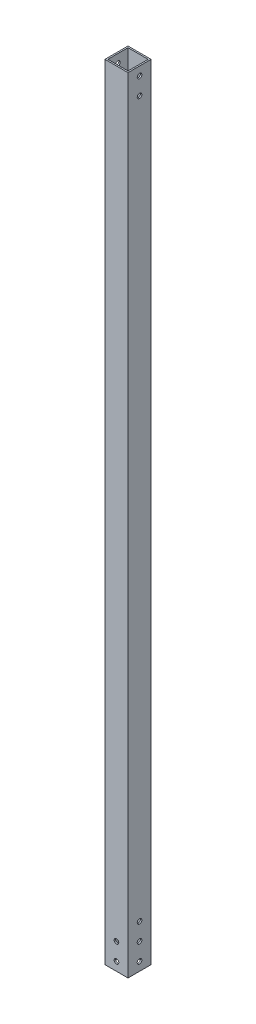
ISO-10303-21;
HEADER;
FILE_DESCRIPTION(('STEP AP214'),'2;1');
FILE_NAME('part.step','',(''),(''),'','','');
FILE_SCHEMA(('AUTOMOTIVE_DESIGN { 1 0 10303 214 1 1 1 1 }'));
ENDSEC;
DATA;
#1=APPLICATION_CONTEXT('core data for automotive mechanical design processes');
#2=APPLICATION_PROTOCOL_DEFINITION('international standard','automotive_design',2000,#1);
#3=PRODUCT_CONTEXT('',#1,'mechanical');
#4=PRODUCT('Part','Part','',(#3));
#5=PRODUCT_RELATED_PRODUCT_CATEGORY('part','',(#4));
#6=PRODUCT_DEFINITION_FORMATION('','',#4);
#7=PRODUCT_DEFINITION_CONTEXT('part definition',#1,'design');
#8=PRODUCT_DEFINITION('design','',#6,#7);
#9=PRODUCT_DEFINITION_SHAPE('','',#8);
#10=(LENGTH_UNIT() NAMED_UNIT(*) SI_UNIT(.MILLI.,.METRE.));
#11=(NAMED_UNIT(*) PLANE_ANGLE_UNIT() SI_UNIT($,.RADIAN.));
#12=(NAMED_UNIT(*) SI_UNIT($,.STERADIAN.) SOLID_ANGLE_UNIT());
#13=UNCERTAINTY_MEASURE_WITH_UNIT(LENGTH_MEASURE(1.E-05),#10,'distance_accuracy_value','');
#14=(GEOMETRIC_REPRESENTATION_CONTEXT(3) GLOBAL_UNCERTAINTY_ASSIGNED_CONTEXT((#13)) GLOBAL_UNIT_ASSIGNED_CONTEXT((#10,
#11,#12)) REPRESENTATION_CONTEXT('',''));
#15=CARTESIAN_POINT('',(0.,0.,0.));
#16=DIRECTION('',(0.,0.,1.));
#17=DIRECTION('',(1.,0.,0.));
#18=AXIS2_PLACEMENT_3D('',#15,#16,#17);
#19=CARTESIAN_POINT('',(0.,863.6,0.));
#20=DIRECTION('',(0.,1.,0.));
#21=DIRECTION('',(0.,0.,1.));
#22=AXIS2_PLACEMENT_3D('',#19,#20,#21);
#23=PLANE('',#22);
#24=DIRECTION('',(0.,0.,1.));
#25=VECTOR('',#24,1.);
#26=CARTESIAN_POINT('',(-12.7,863.6,12.7));
#27=LINE('',#26,#25);
#28=CARTESIAN_POINT('',(-12.7,863.6,-12.7));
#29=VERTEX_POINT('',#28);
#30=CARTESIAN_POINT('',(-12.7,863.6,12.7));
#31=VERTEX_POINT('',#30);
#32=EDGE_CURVE('E137',#29,#31,#27,.T.);
#33=ORIENTED_EDGE('',*,*,#32,.T.);
#34=DIRECTION('',(1.,0.,0.));
#35=VECTOR('',#34,1.);
#36=CARTESIAN_POINT('',(12.7,863.6,12.7));
#37=LINE('',#36,#35);
#38=CARTESIAN_POINT('',(12.7,863.6,12.7));
#39=VERTEX_POINT('',#38);
#40=EDGE_CURVE('E140',#31,#39,#37,.T.);
#41=ORIENTED_EDGE('',*,*,#40,.T.);
#42=DIRECTION('',(0.,0.,-1.));
#43=VECTOR('',#42,1.);
#44=CARTESIAN_POINT('',(12.7,863.6,12.7));
#45=LINE('',#44,#43);
#46=CARTESIAN_POINT('',(12.7,863.6,-12.7));
#47=VERTEX_POINT('',#46);
#48=EDGE_CURVE('E143',#39,#47,#45,.T.);
#49=ORIENTED_EDGE('',*,*,#48,.T.);
#50=DIRECTION('',(-1.,0.,0.));
#51=VECTOR('',#50,1.);
#52=CARTESIAN_POINT('',(12.7,863.6,-12.7));
#53=LINE('',#52,#51);
#54=EDGE_CURVE('E145',#47,#29,#53,.T.);
#55=ORIENTED_EDGE('',*,*,#54,.T.);
#56=EDGE_LOOP('',(#33,#41,#49,#55));
#57=FACE_BOUND('',#56,.T.);
#58=DIRECTION('',(-1.,0.,0.));
#59=VECTOR('',#58,1.);
#60=CARTESIAN_POINT('',(11.1125,863.6,-11.1125));
#61=LINE('',#60,#59);
#62=CARTESIAN_POINT('',(11.1125,863.6,-11.1125));
#63=VERTEX_POINT('',#62);
#64=CARTESIAN_POINT('',(-11.1125,863.6,-11.1125));
#65=VERTEX_POINT('',#64);
#66=EDGE_CURVE('E107',#63,#65,#61,.T.);
#67=ORIENTED_EDGE('',*,*,#66,.F.);
#68=DIRECTION('',(0.,0.,-1.));
#69=VECTOR('',#68,1.);
#70=CARTESIAN_POINT('',(11.1125,863.6,11.1125));
#71=LINE('',#70,#69);
#72=CARTESIAN_POINT('',(11.1125,863.6,11.1125));
#73=VERTEX_POINT('',#72);
#74=EDGE_CURVE('E99',#73,#63,#71,.T.);
#75=ORIENTED_EDGE('',*,*,#74,.F.);
#76=DIRECTION('',(1.,0.,0.));
#77=VECTOR('',#76,1.);
#78=CARTESIAN_POINT('',(11.1125,863.6,11.1125));
#79=LINE('',#78,#77);
#80=CARTESIAN_POINT('',(-11.1125,863.6,11.1125));
#81=VERTEX_POINT('',#80);
#82=EDGE_CURVE('E121',#81,#73,#79,.T.);
#83=ORIENTED_EDGE('',*,*,#82,.F.);
#84=DIRECTION('',(0.,0.,1.));
#85=VECTOR('',#84,1.);
#86=CARTESIAN_POINT('',(-11.1125,863.6,11.1125));
#87=LINE('',#86,#85);
#88=EDGE_CURVE('E119',#65,#81,#87,.T.);
#89=ORIENTED_EDGE('',*,*,#88,.F.);
#90=EDGE_LOOP('',(#67,#75,#83,#89));
#91=FACE_BOUND('',#90,.T.);
#92=ADVANCED_FACE('F32',(#57,#91),#23,.T.);
#93=CARTESIAN_POINT('',(0.,0.,0.));
#94=DIRECTION('',(0.,1.,0.));
#95=DIRECTION('',(0.,0.,1.));
#96=AXIS2_PLACEMENT_3D('',#93,#94,#95);
#97=PLANE('',#96);
#98=DIRECTION('',(0.,0.,1.));
#99=VECTOR('',#98,1.);
#100=CARTESIAN_POINT('',(-12.7,0.,12.7));
#101=LINE('',#100,#99);
#102=CARTESIAN_POINT('',(-12.7,0.,-12.7));
#103=VERTEX_POINT('',#102);
#104=CARTESIAN_POINT('',(-12.7,0.,12.7));
#105=VERTEX_POINT('',#104);
#106=EDGE_CURVE('E115',#103,#105,#101,.T.);
#107=ORIENTED_EDGE('',*,*,#106,.F.);
#108=DIRECTION('',(-1.,0.,0.));
#109=VECTOR('',#108,1.);
#110=CARTESIAN_POINT('',(12.7,0.,-12.7));
#111=LINE('',#110,#109);
#112=CARTESIAN_POINT('',(12.7,0.,-12.7));
#113=VERTEX_POINT('',#112);
#114=EDGE_CURVE('E141',#113,#103,#111,.T.);
#115=ORIENTED_EDGE('',*,*,#114,.F.);
#116=DIRECTION('',(0.,0.,-1.));
#117=VECTOR('',#116,1.);
#118=CARTESIAN_POINT('',(12.7,0.,12.7));
#119=LINE('',#118,#117);
#120=CARTESIAN_POINT('',(12.7,0.,12.7));
#121=VERTEX_POINT('',#120);
#122=EDGE_CURVE('E152',#121,#113,#119,.T.);
#123=ORIENTED_EDGE('',*,*,#122,.F.);
#124=DIRECTION('',(1.,0.,0.));
#125=VECTOR('',#124,1.);
#126=CARTESIAN_POINT('',(12.7,0.,12.7));
#127=LINE('',#126,#125);
#128=EDGE_CURVE('E150',#105,#121,#127,.T.);
#129=ORIENTED_EDGE('',*,*,#128,.F.);
#130=EDGE_LOOP('',(#107,#115,#123,#129));
#131=FACE_BOUND('',#130,.T.);
#132=DIRECTION('',(0.,0.,-1.));
#133=VECTOR('',#132,1.);
#134=CARTESIAN_POINT('',(11.1125,0.,11.1125));
#135=LINE('',#134,#133);
#136=CARTESIAN_POINT('',(11.1125,0.,11.1125));
#137=VERTEX_POINT('',#136);
#138=CARTESIAN_POINT('',(11.1125,0.,-11.1125));
#139=VERTEX_POINT('',#138);
#140=EDGE_CURVE('E57',#137,#139,#135,.T.);
#141=ORIENTED_EDGE('',*,*,#140,.T.);
#142=DIRECTION('',(-1.,0.,0.));
#143=VECTOR('',#142,1.);
#144=CARTESIAN_POINT('',(11.1125,0.,-11.1125));
#145=LINE('',#144,#143);
#146=CARTESIAN_POINT('',(-11.1125,0.,-11.1125));
#147=VERTEX_POINT('',#146);
#148=EDGE_CURVE('E114',#139,#147,#145,.T.);
#149=ORIENTED_EDGE('',*,*,#148,.T.);
#150=DIRECTION('',(0.,0.,1.));
#151=VECTOR('',#150,1.);
#152=CARTESIAN_POINT('',(-11.1125,0.,11.1125));
#153=LINE('',#152,#151);
#154=CARTESIAN_POINT('',(-11.1125,0.,11.1125));
#155=VERTEX_POINT('',#154);
#156=EDGE_CURVE('E129',#147,#155,#153,.T.);
#157=ORIENTED_EDGE('',*,*,#156,.T.);
#158=DIRECTION('',(1.,0.,0.));
#159=VECTOR('',#158,1.);
#160=CARTESIAN_POINT('',(11.1125,0.,11.1125));
#161=LINE('',#160,#159);
#162=EDGE_CURVE('E108',#155,#137,#161,.T.);
#163=ORIENTED_EDGE('',*,*,#162,.T.);
#164=EDGE_LOOP('',(#141,#149,#157,#163));
#165=FACE_BOUND('',#164,.T.);
#166=ADVANCED_FACE('F247',(#131,#165),#97,.F.);
#167=CARTESIAN_POINT('',(-12.7,863.6,12.7));
#168=DIRECTION('',(1.,0.,0.));
#169=DIRECTION('',(0.,0.,-1.));
#170=AXIS2_PLACEMENT_3D('',#167,#168,#169);
#171=PLANE('',#170);
#172=CARTESIAN_POINT('',(-12.7,9.525,0.));
#173=DIRECTION('',(1.,0.,0.));
#174=DIRECTION('',(0.,0.,-1.));
#175=AXIS2_PLACEMENT_3D('',#172,#173,#174);
#176=CIRCLE('',#175,2.5527);
#177=CARTESIAN_POINT('',(-12.7,9.525,-2.5527));
#178=VERTEX_POINT('',#177);
#179=EDGE_CURVE('E174',#178,#178,#176,.T.);
#180=ORIENTED_EDGE('',*,*,#179,.T.);
#181=EDGE_LOOP('',(#180));
#182=FACE_BOUND('',#181,.T.);
#183=CARTESIAN_POINT('',(-12.7,28.575,0.));
#184=DIRECTION('',(1.,0.,0.));
#185=DIRECTION('',(0.,0.,-1.));
#186=AXIS2_PLACEMENT_3D('',#183,#184,#185);
#187=CIRCLE('',#186,2.5527);
#188=CARTESIAN_POINT('',(-12.7,28.575,-2.5527));
#189=VERTEX_POINT('',#188);
#190=EDGE_CURVE('E325',#189,#189,#187,.T.);
#191=ORIENTED_EDGE('',*,*,#190,.T.);
#192=EDGE_LOOP('',(#191));
#193=FACE_BOUND('',#192,.T.);
#194=CARTESIAN_POINT('',(-12.7,47.625,0.));
#195=DIRECTION('',(1.,0.,0.));
#196=DIRECTION('',(0.,0.,-1.));
#197=AXIS2_PLACEMENT_3D('',#194,#195,#196);
#198=CIRCLE('',#197,2.5527);
#199=CARTESIAN_POINT('',(-12.7,47.625,-2.5527));
#200=VERTEX_POINT('',#199);
#201=EDGE_CURVE('E335',#200,#200,#198,.T.);
#202=ORIENTED_EDGE('',*,*,#201,.T.);
#203=EDGE_LOOP('',(#202));
#204=FACE_BOUND('',#203,.T.);
#205=CARTESIAN_POINT('',(-12.7,854.075,0.));
#206=DIRECTION('',(1.,0.,0.));
#207=DIRECTION('',(0.,0.,-1.));
#208=AXIS2_PLACEMENT_3D('',#205,#206,#207);
#209=CIRCLE('',#208,2.55270000000004);
#210=CARTESIAN_POINT('',(-12.7,854.075,-2.55270000000004));
#211=VERTEX_POINT('',#210);
#212=EDGE_CURVE('E341',#211,#211,#209,.T.);
#213=ORIENTED_EDGE('',*,*,#212,.T.);
#214=EDGE_LOOP('',(#213));
#215=FACE_BOUND('',#214,.T.);
#216=CARTESIAN_POINT('',(-12.7,835.025,0.));
#217=DIRECTION('',(1.,0.,0.));
#218=DIRECTION('',(0.,0.,-1.));
#219=AXIS2_PLACEMENT_3D('',#216,#217,#218);
#220=CIRCLE('',#219,2.55270000000004);
#221=CARTESIAN_POINT('',(-12.7,835.025,-2.55270000000004));
#222=VERTEX_POINT('',#221);
#223=EDGE_CURVE('E347',#222,#222,#220,.T.);
#224=ORIENTED_EDGE('',*,*,#223,.T.);
#225=EDGE_LOOP('',(#224));
#226=FACE_BOUND('',#225,.T.);
#227=ORIENTED_EDGE('',*,*,#106,.T.);
#228=DIRECTION('',(0.,-1.,0.));
#229=VECTOR('',#228,1.);
#230=CARTESIAN_POINT('',(-12.7,863.6,12.7));
#231=LINE('',#230,#229);
#232=EDGE_CURVE('E11',#31,#105,#231,.T.);
#233=ORIENTED_EDGE('',*,*,#232,.F.);
#234=ORIENTED_EDGE('',*,*,#32,.F.);
#235=DIRECTION('',(0.,-1.,0.));
#236=VECTOR('',#235,1.);
#237=CARTESIAN_POINT('',(-12.7,863.6,-12.7));
#238=LINE('',#237,#236);
#239=EDGE_CURVE('E147',#29,#103,#238,.T.);
#240=ORIENTED_EDGE('',*,*,#239,.T.);
#241=EDGE_LOOP('',(#227,#233,#234,#240));
#242=FACE_BOUND('',#241,.T.);
#243=ADVANCED_FACE('F34',(#182,#193,#204,#215,#226,#242),#171,.F.);
#244=CARTESIAN_POINT('',(12.7,863.6,12.7));
#245=DIRECTION('',(0.,0.,-1.));
#246=DIRECTION('',(-1.,0.,0.));
#247=AXIS2_PLACEMENT_3D('',#244,#245,#246);
#248=PLANE('',#247);
#249=CARTESIAN_POINT('',(0.,9.525,12.7));
#250=DIRECTION('',(0.,0.,1.));
#251=DIRECTION('',(1.,0.,0.));
#252=AXIS2_PLACEMENT_3D('',#249,#250,#251);
#253=CIRCLE('',#252,2.5527);
#254=CARTESIAN_POINT('',(2.5527,9.525,12.7));
#255=VERTEX_POINT('',#254);
#256=EDGE_CURVE('E202',#255,#255,#253,.T.);
#257=ORIENTED_EDGE('',*,*,#256,.F.);
#258=EDGE_LOOP('',(#257));
#259=FACE_BOUND('',#258,.T.);
#260=CARTESIAN_POINT('',(0.,28.575,12.7));
#261=DIRECTION('',(0.,0.,1.));
#262=DIRECTION('',(1.,0.,0.));
#263=AXIS2_PLACEMENT_3D('',#260,#261,#262);
#264=CIRCLE('',#263,2.5527);
#265=CARTESIAN_POINT('',(2.5527,28.575,12.7));
#266=VERTEX_POINT('',#265);
#267=EDGE_CURVE('E199',#266,#266,#264,.T.);
#268=ORIENTED_EDGE('',*,*,#267,.F.);
#269=EDGE_LOOP('',(#268));
#270=FACE_BOUND('',#269,.T.);
#271=ORIENTED_EDGE('',*,*,#128,.T.);
#272=DIRECTION('',(0.,-1.,0.));
#273=VECTOR('',#272,1.);
#274=CARTESIAN_POINT('',(12.7,863.6,12.7));
#275=LINE('',#274,#273);
#276=EDGE_CURVE('E41',#39,#121,#275,.T.);
#277=ORIENTED_EDGE('',*,*,#276,.F.);
#278=ORIENTED_EDGE('',*,*,#40,.F.);
#279=ORIENTED_EDGE('',*,*,#232,.T.);
#280=EDGE_LOOP('',(#271,#277,#278,#279));
#281=FACE_BOUND('',#280,.T.);
#282=ADVANCED_FACE('F251',(#259,#270,#281),#248,.F.);
#283=CARTESIAN_POINT('',(12.7,863.6,12.7));
#284=DIRECTION('',(-1.,0.,0.));
#285=DIRECTION('',(0.,0.,1.));
#286=AXIS2_PLACEMENT_3D('',#283,#284,#285);
#287=PLANE('',#286);
#288=CARTESIAN_POINT('',(12.7,9.525,0.));
#289=DIRECTION('',(1.,0.,0.));
#290=DIRECTION('',(0.,0.,-1.));
#291=AXIS2_PLACEMENT_3D('',#288,#289,#290);
#292=CIRCLE('',#291,2.5527);
#293=CARTESIAN_POINT('',(12.7,9.525,-2.5527));
#294=VERTEX_POINT('',#293);
#295=EDGE_CURVE('E324',#294,#294,#292,.T.);
#296=ORIENTED_EDGE('',*,*,#295,.F.);
#297=EDGE_LOOP('',(#296));
#298=FACE_BOUND('',#297,.T.);
#299=CARTESIAN_POINT('',(12.7,28.575,0.));
#300=DIRECTION('',(1.,0.,0.));
#301=DIRECTION('',(0.,0.,-1.));
#302=AXIS2_PLACEMENT_3D('',#299,#300,#301);
#303=CIRCLE('',#302,2.5527);
#304=CARTESIAN_POINT('',(12.7,28.575,-2.5527));
#305=VERTEX_POINT('',#304);
#306=EDGE_CURVE('E330',#305,#305,#303,.T.);
#307=ORIENTED_EDGE('',*,*,#306,.F.);
#308=EDGE_LOOP('',(#307));
#309=FACE_BOUND('',#308,.T.);
#310=CARTESIAN_POINT('',(12.7,47.625,0.));
#311=DIRECTION('',(1.,0.,0.));
#312=DIRECTION('',(0.,0.,-1.));
#313=AXIS2_PLACEMENT_3D('',#310,#311,#312);
#314=CIRCLE('',#313,2.5527);
#315=CARTESIAN_POINT('',(12.7,47.625,-2.5527));
#316=VERTEX_POINT('',#315);
#317=EDGE_CURVE('E338',#316,#316,#314,.T.);
#318=ORIENTED_EDGE('',*,*,#317,.F.);
#319=EDGE_LOOP('',(#318));
#320=FACE_BOUND('',#319,.T.);
#321=CARTESIAN_POINT('',(12.7,854.075,0.));
#322=DIRECTION('',(1.,0.,0.));
#323=DIRECTION('',(0.,0.,-1.));
#324=AXIS2_PLACEMENT_3D('',#321,#322,#323);
#325=CIRCLE('',#324,2.55270000000004);
#326=CARTESIAN_POINT('',(12.7,854.075,-2.55270000000004));
#327=VERTEX_POINT('',#326);
#328=EDGE_CURVE('E344',#327,#327,#325,.T.);
#329=ORIENTED_EDGE('',*,*,#328,.F.);
#330=EDGE_LOOP('',(#329));
#331=FACE_BOUND('',#330,.T.);
#332=CARTESIAN_POINT('',(12.7,835.025,0.));
#333=DIRECTION('',(1.,0.,0.));
#334=DIRECTION('',(0.,0.,-1.));
#335=AXIS2_PLACEMENT_3D('',#332,#333,#334);
#336=CIRCLE('',#335,2.55270000000004);
#337=CARTESIAN_POINT('',(12.7,835.025,-2.55270000000004));
#338=VERTEX_POINT('',#337);
#339=EDGE_CURVE('E350',#338,#338,#336,.T.);
#340=ORIENTED_EDGE('',*,*,#339,.F.);
#341=EDGE_LOOP('',(#340));
#342=FACE_BOUND('',#341,.T.);
#343=ORIENTED_EDGE('',*,*,#122,.T.);
#344=DIRECTION('',(0.,-1.,0.));
#345=VECTOR('',#344,1.);
#346=CARTESIAN_POINT('',(12.7,863.6,-12.7));
#347=LINE('',#346,#345);
#348=EDGE_CURVE('E157',#47,#113,#347,.T.);
#349=ORIENTED_EDGE('',*,*,#348,.F.);
#350=ORIENTED_EDGE('',*,*,#48,.F.);
#351=ORIENTED_EDGE('',*,*,#276,.T.);
#352=EDGE_LOOP('',(#343,#349,#350,#351));
#353=FACE_BOUND('',#352,.T.);
#354=ADVANCED_FACE('F234',(#298,#309,#320,#331,#342,#353),#287,.F.);
#355=CARTESIAN_POINT('',(12.7,863.6,-12.7));
#356=DIRECTION('',(0.,0.,1.));
#357=DIRECTION('',(1.,0.,0.));
#358=AXIS2_PLACEMENT_3D('',#355,#356,#357);
#359=PLANE('',#358);
#360=CARTESIAN_POINT('',(0.,9.525,-12.7));
#361=DIRECTION('',(0.,0.,1.));
#362=DIRECTION('',(1.,0.,0.));
#363=AXIS2_PLACEMENT_3D('',#360,#361,#362);
#364=CIRCLE('',#363,2.5527);
#365=CARTESIAN_POINT('',(2.5527,9.525,-12.7));
#366=VERTEX_POINT('',#365);
#367=EDGE_CURVE('E166',#366,#366,#364,.T.);
#368=ORIENTED_EDGE('',*,*,#367,.T.);
#369=EDGE_LOOP('',(#368));
#370=FACE_BOUND('',#369,.T.);
#371=CARTESIAN_POINT('',(0.,28.575,-12.7));
#372=DIRECTION('',(0.,0.,1.));
#373=DIRECTION('',(1.,0.,0.));
#374=AXIS2_PLACEMENT_3D('',#371,#372,#373);
#375=CIRCLE('',#374,2.5527);
#376=CARTESIAN_POINT('',(2.5527,28.575,-12.7));
#377=VERTEX_POINT('',#376);
#378=EDGE_CURVE('E205',#377,#377,#375,.T.);
#379=ORIENTED_EDGE('',*,*,#378,.T.);
#380=EDGE_LOOP('',(#379));
#381=FACE_BOUND('',#380,.T.);
#382=ORIENTED_EDGE('',*,*,#114,.T.);
#383=ORIENTED_EDGE('',*,*,#239,.F.);
#384=ORIENTED_EDGE('',*,*,#54,.F.);
#385=ORIENTED_EDGE('',*,*,#348,.T.);
#386=EDGE_LOOP('',(#382,#383,#384,#385));
#387=FACE_BOUND('',#386,.T.);
#388=ADVANCED_FACE('F231',(#370,#381,#387),#359,.F.);
#389=CARTESIAN_POINT('',(11.1125,863.6,11.1125));
#390=DIRECTION('',(-1.,0.,0.));
#391=DIRECTION('',(0.,0.,1.));
#392=AXIS2_PLACEMENT_3D('',#389,#390,#391);
#393=PLANE('',#392);
#394=CARTESIAN_POINT('',(11.1125,9.525,0.));
#395=DIRECTION('',(-1.,0.,0.));
#396=DIRECTION('',(0.,0.,1.));
#397=AXIS2_PLACEMENT_3D('',#394,#395,#396);
#398=CIRCLE('',#397,2.5527);
#399=CARTESIAN_POINT('',(11.1125,9.525,2.5527));
#400=VERTEX_POINT('',#399);
#401=EDGE_CURVE('E196',#400,#400,#398,.T.);
#402=ORIENTED_EDGE('',*,*,#401,.F.);
#403=EDGE_LOOP('',(#402));
#404=FACE_BOUND('',#403,.T.);
#405=CARTESIAN_POINT('',(11.1125,28.575,0.));
#406=DIRECTION('',(-1.,0.,0.));
#407=DIRECTION('',(0.,0.,1.));
#408=AXIS2_PLACEMENT_3D('',#405,#406,#407);
#409=CIRCLE('',#408,2.5527);
#410=CARTESIAN_POINT('',(11.1125,28.575,2.5527));
#411=VERTEX_POINT('',#410);
#412=EDGE_CURVE('E184',#411,#411,#409,.T.);
#413=ORIENTED_EDGE('',*,*,#412,.F.);
#414=EDGE_LOOP('',(#413));
#415=FACE_BOUND('',#414,.T.);
#416=CARTESIAN_POINT('',(11.1125,47.625,0.));
#417=DIRECTION('',(-1.,0.,0.));
#418=DIRECTION('',(0.,0.,1.));
#419=AXIS2_PLACEMENT_3D('',#416,#417,#418);
#420=CIRCLE('',#419,2.5527);
#421=CARTESIAN_POINT('',(11.1125,47.625,2.5527));
#422=VERTEX_POINT('',#421);
#423=EDGE_CURVE('E181',#422,#422,#420,.T.);
#424=ORIENTED_EDGE('',*,*,#423,.F.);
#425=EDGE_LOOP('',(#424));
#426=FACE_BOUND('',#425,.T.);
#427=CARTESIAN_POINT('',(11.1125,854.075,0.));
#428=DIRECTION('',(-1.,0.,0.));
#429=DIRECTION('',(0.,0.,1.));
#430=AXIS2_PLACEMENT_3D('',#427,#428,#429);
#431=CIRCLE('',#430,2.55270000000004);
#432=CARTESIAN_POINT('',(11.1125,854.075,2.55270000000004));
#433=VERTEX_POINT('',#432);
#434=EDGE_CURVE('E178',#433,#433,#431,.T.);
#435=ORIENTED_EDGE('',*,*,#434,.F.);
#436=EDGE_LOOP('',(#435));
#437=FACE_BOUND('',#436,.T.);
#438=CARTESIAN_POINT('',(11.1125,835.025,0.));
#439=DIRECTION('',(-1.,0.,0.));
#440=DIRECTION('',(0.,0.,1.));
#441=AXIS2_PLACEMENT_3D('',#438,#439,#440);
#442=CIRCLE('',#441,2.55270000000004);
#443=CARTESIAN_POINT('',(11.1125,835.025,2.55270000000004));
#444=VERTEX_POINT('',#443);
#445=EDGE_CURVE('E173',#444,#444,#442,.T.);
#446=ORIENTED_EDGE('',*,*,#445,.F.);
#447=EDGE_LOOP('',(#446));
#448=FACE_BOUND('',#447,.T.);
#449=ORIENTED_EDGE('',*,*,#140,.F.);
#450=DIRECTION('',(0.,-1.,0.));
#451=VECTOR('',#450,1.);
#452=CARTESIAN_POINT('',(11.1125,863.6,11.1125));
#453=LINE('',#452,#451);
#454=EDGE_CURVE('E103',#73,#137,#453,.T.);
#455=ORIENTED_EDGE('',*,*,#454,.F.);
#456=ORIENTED_EDGE('',*,*,#74,.T.);
#457=DIRECTION('',(0.,-1.,0.));
#458=VECTOR('',#457,1.);
#459=CARTESIAN_POINT('',(11.1125,863.6,-11.1125));
#460=LINE('',#459,#458);
#461=EDGE_CURVE('E102',#63,#139,#460,.T.);
#462=ORIENTED_EDGE('',*,*,#461,.T.);
#463=EDGE_LOOP('',(#449,#455,#456,#462));
#464=FACE_BOUND('',#463,.T.);
#465=ADVANCED_FACE('F101',(#404,#415,#426,#437,#448,#464),#393,.T.);
#466=CARTESIAN_POINT('',(11.1125,863.6,-11.1125));
#467=DIRECTION('',(0.,0.,1.));
#468=DIRECTION('',(1.,0.,0.));
#469=AXIS2_PLACEMENT_3D('',#466,#467,#468);
#470=PLANE('',#469);
#471=CARTESIAN_POINT('',(0.,9.525,-11.1125));
#472=DIRECTION('',(0.,0.,1.));
#473=DIRECTION('',(1.,0.,0.));
#474=AXIS2_PLACEMENT_3D('',#471,#472,#473);
#475=CIRCLE('',#474,2.5527);
#476=CARTESIAN_POINT('',(2.5527,9.525,-11.1125));
#477=VERTEX_POINT('',#476);
#478=EDGE_CURVE('E127',#477,#477,#475,.T.);
#479=ORIENTED_EDGE('',*,*,#478,.F.);
#480=EDGE_LOOP('',(#479));
#481=FACE_BOUND('',#480,.T.);
#482=CARTESIAN_POINT('',(0.,28.575,-11.1125));
#483=DIRECTION('',(0.,0.,1.));
#484=DIRECTION('',(1.,0.,0.));
#485=AXIS2_PLACEMENT_3D('',#482,#483,#484);
#486=CIRCLE('',#485,2.5527);
#487=CARTESIAN_POINT('',(2.5527,28.575,-11.1125));
#488=VERTEX_POINT('',#487);
#489=EDGE_CURVE('E165',#488,#488,#486,.T.);
#490=ORIENTED_EDGE('',*,*,#489,.F.);
#491=EDGE_LOOP('',(#490));
#492=FACE_BOUND('',#491,.T.);
#493=ORIENTED_EDGE('',*,*,#148,.F.);
#494=ORIENTED_EDGE('',*,*,#461,.F.);
#495=ORIENTED_EDGE('',*,*,#66,.T.);
#496=DIRECTION('',(0.,-1.,0.));
#497=VECTOR('',#496,1.);
#498=CARTESIAN_POINT('',(-11.1125,863.6,-11.1125));
#499=LINE('',#498,#497);
#500=EDGE_CURVE('E116',#65,#147,#499,.T.);
#501=ORIENTED_EDGE('',*,*,#500,.T.);
#502=EDGE_LOOP('',(#493,#494,#495,#501));
#503=FACE_BOUND('',#502,.T.);
#504=ADVANCED_FACE('F111',(#481,#492,#503),#470,.T.);
#505=CARTESIAN_POINT('',(-11.1125,863.6,11.1125));
#506=DIRECTION('',(1.,0.,0.));
#507=DIRECTION('',(0.,0.,-1.));
#508=AXIS2_PLACEMENT_3D('',#505,#506,#507);
#509=PLANE('',#508);
#510=CARTESIAN_POINT('',(-11.1125,9.525,0.));
#511=DIRECTION('',(1.,0.,0.));
#512=DIRECTION('',(0.,0.,-1.));
#513=AXIS2_PLACEMENT_3D('',#510,#511,#512);
#514=CIRCLE('',#513,2.5527);
#515=CARTESIAN_POINT('',(-11.1125,9.525,-2.5527));
#516=VERTEX_POINT('',#515);
#517=EDGE_CURVE('E36',#516,#516,#514,.T.);
#518=ORIENTED_EDGE('',*,*,#517,.F.);
#519=EDGE_LOOP('',(#518));
#520=FACE_BOUND('',#519,.T.);
#521=CARTESIAN_POINT('',(-11.1125,28.575,0.));
#522=DIRECTION('',(1.,0.,0.));
#523=DIRECTION('',(0.,0.,-1.));
#524=AXIS2_PLACEMENT_3D('',#521,#522,#523);
#525=CIRCLE('',#524,2.5527);
#526=CARTESIAN_POINT('',(-11.1125,28.575,-2.5527));
#527=VERTEX_POINT('',#526);
#528=EDGE_CURVE('E182',#527,#527,#525,.T.);
#529=ORIENTED_EDGE('',*,*,#528,.F.);
#530=EDGE_LOOP('',(#529));
#531=FACE_BOUND('',#530,.T.);
#532=CARTESIAN_POINT('',(-11.1125,47.625,0.));
#533=DIRECTION('',(1.,0.,0.));
#534=DIRECTION('',(0.,0.,-1.));
#535=AXIS2_PLACEMENT_3D('',#532,#533,#534);
#536=CIRCLE('',#535,2.5527);
#537=CARTESIAN_POINT('',(-11.1125,47.625,-2.5527));
#538=VERTEX_POINT('',#537);
#539=EDGE_CURVE('E179',#538,#538,#536,.T.);
#540=ORIENTED_EDGE('',*,*,#539,.F.);
#541=EDGE_LOOP('',(#540));
#542=FACE_BOUND('',#541,.T.);
#543=CARTESIAN_POINT('',(-11.1125,854.075,0.));
#544=DIRECTION('',(1.,0.,0.));
#545=DIRECTION('',(0.,0.,-1.));
#546=AXIS2_PLACEMENT_3D('',#543,#544,#545);
#547=CIRCLE('',#546,2.55270000000004);
#548=CARTESIAN_POINT('',(-11.1125,854.075,-2.55270000000004));
#549=VERTEX_POINT('',#548);
#550=EDGE_CURVE('E175',#549,#549,#547,.T.);
#551=ORIENTED_EDGE('',*,*,#550,.F.);
#552=EDGE_LOOP('',(#551));
#553=FACE_BOUND('',#552,.T.);
#554=CARTESIAN_POINT('',(-11.1125,835.025,0.));
#555=DIRECTION('',(1.,0.,0.));
#556=DIRECTION('',(0.,0.,-1.));
#557=AXIS2_PLACEMENT_3D('',#554,#555,#556);
#558=CIRCLE('',#557,2.55270000000004);
#559=CARTESIAN_POINT('',(-11.1125,835.025,-2.55270000000004));
#560=VERTEX_POINT('',#559);
#561=EDGE_CURVE('E170',#560,#560,#558,.T.);
#562=ORIENTED_EDGE('',*,*,#561,.F.);
#563=EDGE_LOOP('',(#562));
#564=FACE_BOUND('',#563,.T.);
#565=ORIENTED_EDGE('',*,*,#156,.F.);
#566=ORIENTED_EDGE('',*,*,#500,.F.);
#567=ORIENTED_EDGE('',*,*,#88,.T.);
#568=DIRECTION('',(0.,-1.,0.));
#569=VECTOR('',#568,1.);
#570=CARTESIAN_POINT('',(-11.1125,863.6,11.1125));
#571=LINE('',#570,#569);
#572=EDGE_CURVE('E49',#81,#155,#571,.T.);
#573=ORIENTED_EDGE('',*,*,#572,.T.);
#574=EDGE_LOOP('',(#565,#566,#567,#573));
#575=FACE_BOUND('',#574,.T.);
#576=ADVANCED_FACE('F219',(#520,#531,#542,#553,#564,#575),#509,.T.);
#577=CARTESIAN_POINT('',(11.1125,863.6,11.1125));
#578=DIRECTION('',(0.,0.,-1.));
#579=DIRECTION('',(-1.,0.,0.));
#580=AXIS2_PLACEMENT_3D('',#577,#578,#579);
#581=PLANE('',#580);
#582=CARTESIAN_POINT('',(0.,9.525,11.1125));
#583=DIRECTION('',(0.,0.,-1.));
#584=DIRECTION('',(-1.,0.,0.));
#585=AXIS2_PLACEMENT_3D('',#582,#583,#584);
#586=CIRCLE('',#585,2.5527);
#587=CARTESIAN_POINT('',(2.5527,9.525,11.1125));
#588=VERTEX_POINT('',#587);
#589=EDGE_CURVE('E167',#588,#588,#586,.T.);
#590=ORIENTED_EDGE('',*,*,#589,.F.);
#591=EDGE_LOOP('',(#590));
#592=FACE_BOUND('',#591,.T.);
#593=CARTESIAN_POINT('',(0.,28.575,11.1125));
#594=DIRECTION('',(0.,0.,-1.));
#595=DIRECTION('',(-1.,0.,0.));
#596=AXIS2_PLACEMENT_3D('',#593,#594,#595);
#597=CIRCLE('',#596,2.5527);
#598=CARTESIAN_POINT('',(2.5527,28.575,11.1125));
#599=VERTEX_POINT('',#598);
#600=EDGE_CURVE('E162',#599,#599,#597,.T.);
#601=ORIENTED_EDGE('',*,*,#600,.F.);
#602=EDGE_LOOP('',(#601));
#603=FACE_BOUND('',#602,.T.);
#604=ORIENTED_EDGE('',*,*,#162,.F.);
#605=ORIENTED_EDGE('',*,*,#572,.F.);
#606=ORIENTED_EDGE('',*,*,#82,.T.);
#607=ORIENTED_EDGE('',*,*,#454,.T.);
#608=EDGE_LOOP('',(#604,#605,#606,#607));
#609=FACE_BOUND('',#608,.T.);
#610=ADVANCED_FACE('F276',(#592,#603,#609),#581,.T.);
#611=CARTESIAN_POINT('',(0.,28.575,-12.7));
#612=DIRECTION('',(0.,0.,1.));
#613=DIRECTION('',(1.,0.,0.));
#614=AXIS2_PLACEMENT_3D('',#611,#612,#613);
#615=CYLINDRICAL_SURFACE('',#614,2.5527);
#616=CARTESIAN_POINT('',(2.5527,28.575,11.1125));
#617=CARTESIAN_POINT('',(2.5527,28.575,11.1290364583333));
#618=CARTESIAN_POINT('',(2.5527,28.575,11.1455729166667));
#619=CARTESIAN_POINT('',(2.5527,28.575,11.1786458333333));
#620=CARTESIAN_POINT('',(2.5527,28.575,11.1951822916667));
#621=CARTESIAN_POINT('',(2.5527,28.575,11.2282552083333));
#622=CARTESIAN_POINT('',(2.5527,28.575,11.2447916666667));
#623=CARTESIAN_POINT('',(2.5527,28.575,11.2778645833333));
#624=CARTESIAN_POINT('',(2.5527,28.575,11.2944010416667));
#625=CARTESIAN_POINT('',(2.5527,28.575,11.3274739583333));
#626=CARTESIAN_POINT('',(2.5527,28.575,11.3440104166667));
#627=CARTESIAN_POINT('',(2.5527,28.575,11.3770833333333));
#628=CARTESIAN_POINT('',(2.5527,28.575,11.3936197916667));
#629=CARTESIAN_POINT('',(2.5527,28.575,11.4266927083333));
#630=CARTESIAN_POINT('',(2.5527,28.575,11.4432291666667));
#631=CARTESIAN_POINT('',(2.5527,28.575,11.4763020833333));
#632=CARTESIAN_POINT('',(2.5527,28.575,11.4928385416667));
#633=CARTESIAN_POINT('',(2.5527,28.575,11.5259114583333));
#634=CARTESIAN_POINT('',(2.5527,28.575,11.5424479166667));
#635=CARTESIAN_POINT('',(2.5527,28.575,11.5755208333333));
#636=CARTESIAN_POINT('',(2.5527,28.575,11.5920572916667));
#637=CARTESIAN_POINT('',(2.5527,28.575,11.6251302083333));
#638=CARTESIAN_POINT('',(2.5527,28.575,11.6416666666667));
#639=CARTESIAN_POINT('',(2.5527,28.575,11.6747395833333));
#640=CARTESIAN_POINT('',(2.5527,28.575,11.6912760416667));
#641=CARTESIAN_POINT('',(2.5527,28.575,11.7243489583333));
#642=CARTESIAN_POINT('',(2.5527,28.575,11.7408854166667));
#643=CARTESIAN_POINT('',(2.5527,28.575,11.7739583333333));
#644=CARTESIAN_POINT('',(2.5527,28.575,11.7904947916667));
#645=CARTESIAN_POINT('',(2.5527,28.575,11.8235677083333));
#646=CARTESIAN_POINT('',(2.5527,28.575,11.8401041666667));
#647=CARTESIAN_POINT('',(2.5527,28.575,11.8731770833333));
#648=CARTESIAN_POINT('',(2.5527,28.575,11.8897135416667));
#649=CARTESIAN_POINT('',(2.5527,28.575,11.9227864583333));
#650=CARTESIAN_POINT('',(2.5527,28.575,11.9393229166667));
#651=CARTESIAN_POINT('',(2.5527,28.575,11.9723958333333));
#652=CARTESIAN_POINT('',(2.5527,28.575,11.9889322916667));
#653=CARTESIAN_POINT('',(2.5527,28.575,12.0220052083333));
#654=CARTESIAN_POINT('',(2.5527,28.575,12.0385416666667));
#655=CARTESIAN_POINT('',(2.5527,28.575,12.0716145833333));
#656=CARTESIAN_POINT('',(2.5527,28.575,12.0881510416667));
#657=CARTESIAN_POINT('',(2.5527,28.575,12.1212239583333));
#658=CARTESIAN_POINT('',(2.5527,28.575,12.1377604166667));
#659=CARTESIAN_POINT('',(2.5527,28.575,12.1708333333333));
#660=CARTESIAN_POINT('',(2.5527,28.575,12.1873697916667));
#661=CARTESIAN_POINT('',(2.5527,28.575,12.2204427083333));
#662=CARTESIAN_POINT('',(2.5527,28.575,12.2369791666667));
#663=CARTESIAN_POINT('',(2.5527,28.575,12.2700520833333));
#664=CARTESIAN_POINT('',(2.5527,28.575,12.2865885416667));
#665=CARTESIAN_POINT('',(2.5527,28.575,12.3196614583333));
#666=CARTESIAN_POINT('',(2.5527,28.575,12.3361979166667));
#667=CARTESIAN_POINT('',(2.5527,28.575,12.3692708333333));
#668=CARTESIAN_POINT('',(2.5527,28.575,12.3858072916667));
#669=CARTESIAN_POINT('',(2.5527,28.575,12.4188802083333));
#670=CARTESIAN_POINT('',(2.5527,28.575,12.4354166666667));
#671=CARTESIAN_POINT('',(2.5527,28.575,12.4684895833333));
#672=CARTESIAN_POINT('',(2.5527,28.575,12.4850260416667));
#673=CARTESIAN_POINT('',(2.5527,28.575,12.5180989583333));
#674=CARTESIAN_POINT('',(2.5527,28.575,12.5346354166667));
#675=CARTESIAN_POINT('',(2.5527,28.575,12.5677083333333));
#676=CARTESIAN_POINT('',(2.5527,28.575,12.5842447916667));
#677=CARTESIAN_POINT('',(2.5527,28.575,12.6173177083333));
#678=CARTESIAN_POINT('',(2.5527,28.575,12.6338541666667));
#679=CARTESIAN_POINT('',(2.5527,28.575,12.6669270833333));
#680=CARTESIAN_POINT('',(2.5527,28.575,12.6834635416667));
#681=CARTESIAN_POINT('',(2.5527,28.575,12.7));
#682=B_SPLINE_CURVE_WITH_KNOTS('',3,(#616,#617,#618,#619,#620,#621,#622,#623,#624,#625,#626,
#627,#628,#629,#630,#631,#632,#633,#634,#635,#636,#637,#638,#639,#640,#641,#642,#643,#644,#645,
#646,#647,#648,#649,#650,#651,#652,#653,#654,#655,#656,#657,#658,#659,#660,#661,#662,#663,#664,
#665,#666,#667,#668,#669,#670,#671,#672,#673,#674,#675,#676,#677,#678,#679,#680,#681),
.UNSPECIFIED.,.F.,.F.,(4,2,2,2,2,2,2,2,2,2,2,2,2,2,2,2,2,2,2,2,2,2,2,2,2,2,2,2,2,2,2,2,4),(0.,
0.0496093749999989,0.0992187500000012,0.148828125,0.198437499999999,0.248046875000001,
0.29765625,0.347265624999999,0.396874999999998,0.446484375,0.496093749999999,0.545703124999998,
0.5953125,0.644921874999999,0.694531249999998,0.744140625,0.793749999999999,0.843359374999998,
0.892968750000001,0.942578124999999,0.992187499999998,1.041796875,1.09140625,1.141015625,
1.190625,1.240234375,1.28984375,1.339453125,1.3890625,1.438671875,1.48828125,1.537890625,
1.5875),.UNSPECIFIED.);
#683=EDGE_CURVE('BSEAM228',#599,#266,#682,.T.);
#684=ORIENTED_EDGE('',*,*,#600,.T.);
#685=ORIENTED_EDGE('',*,*,#267,.T.);
#686=ORIENTED_EDGE('',*,*,#683,.T.);
#687=ORIENTED_EDGE('',*,*,#683,.F.);
#688=EDGE_LOOP('',(#684,#686,#685,#687));
#689=FACE_BOUND('',#688,.T.);
#690=ADVANCED_FACE('F228',(#689),#615,.F.);
#691=CARTESIAN_POINT('',(0.,9.525,-12.7));
#692=DIRECTION('',(0.,0.,1.));
#693=DIRECTION('',(1.,0.,0.));
#694=AXIS2_PLACEMENT_3D('',#691,#692,#693);
#695=CYLINDRICAL_SURFACE('',#694,2.5527);
#696=CARTESIAN_POINT('',(2.5527,9.525,11.1125));
#697=CARTESIAN_POINT('',(2.5527,9.525,11.1290364583333));
#698=CARTESIAN_POINT('',(2.5527,9.525,11.1455729166667));
#699=CARTESIAN_POINT('',(2.5527,9.525,11.1786458333333));
#700=CARTESIAN_POINT('',(2.5527,9.525,11.1951822916667));
#701=CARTESIAN_POINT('',(2.5527,9.525,11.2282552083333));
#702=CARTESIAN_POINT('',(2.5527,9.525,11.2447916666667));
#703=CARTESIAN_POINT('',(2.5527,9.525,11.2778645833333));
#704=CARTESIAN_POINT('',(2.5527,9.525,11.2944010416667));
#705=CARTESIAN_POINT('',(2.5527,9.525,11.3274739583333));
#706=CARTESIAN_POINT('',(2.5527,9.525,11.3440104166667));
#707=CARTESIAN_POINT('',(2.5527,9.525,11.3770833333333));
#708=CARTESIAN_POINT('',(2.5527,9.525,11.3936197916667));
#709=CARTESIAN_POINT('',(2.5527,9.525,11.4266927083333));
#710=CARTESIAN_POINT('',(2.5527,9.525,11.4432291666667));
#711=CARTESIAN_POINT('',(2.5527,9.525,11.4763020833333));
#712=CARTESIAN_POINT('',(2.5527,9.525,11.4928385416667));
#713=CARTESIAN_POINT('',(2.5527,9.525,11.5259114583333));
#714=CARTESIAN_POINT('',(2.5527,9.525,11.5424479166667));
#715=CARTESIAN_POINT('',(2.5527,9.525,11.5755208333333));
#716=CARTESIAN_POINT('',(2.5527,9.525,11.5920572916667));
#717=CARTESIAN_POINT('',(2.5527,9.525,11.6251302083333));
#718=CARTESIAN_POINT('',(2.5527,9.525,11.6416666666667));
#719=CARTESIAN_POINT('',(2.5527,9.525,11.6747395833333));
#720=CARTESIAN_POINT('',(2.5527,9.525,11.6912760416667));
#721=CARTESIAN_POINT('',(2.5527,9.525,11.7243489583333));
#722=CARTESIAN_POINT('',(2.5527,9.525,11.7408854166667));
#723=CARTESIAN_POINT('',(2.5527,9.525,11.7739583333333));
#724=CARTESIAN_POINT('',(2.5527,9.525,11.7904947916667));
#725=CARTESIAN_POINT('',(2.5527,9.525,11.8235677083333));
#726=CARTESIAN_POINT('',(2.5527,9.525,11.8401041666667));
#727=CARTESIAN_POINT('',(2.5527,9.525,11.8731770833333));
#728=CARTESIAN_POINT('',(2.5527,9.525,11.8897135416667));
#729=CARTESIAN_POINT('',(2.5527,9.525,11.9227864583333));
#730=CARTESIAN_POINT('',(2.5527,9.525,11.9393229166667));
#731=CARTESIAN_POINT('',(2.5527,9.525,11.9723958333333));
#732=CARTESIAN_POINT('',(2.5527,9.525,11.9889322916667));
#733=CARTESIAN_POINT('',(2.5527,9.525,12.0220052083333));
#734=CARTESIAN_POINT('',(2.5527,9.525,12.0385416666667));
#735=CARTESIAN_POINT('',(2.5527,9.525,12.0716145833333));
#736=CARTESIAN_POINT('',(2.5527,9.525,12.0881510416667));
#737=CARTESIAN_POINT('',(2.5527,9.525,12.1212239583333));
#738=CARTESIAN_POINT('',(2.5527,9.525,12.1377604166667));
#739=CARTESIAN_POINT('',(2.5527,9.525,12.1708333333333));
#740=CARTESIAN_POINT('',(2.5527,9.525,12.1873697916667));
#741=CARTESIAN_POINT('',(2.5527,9.525,12.2204427083333));
#742=CARTESIAN_POINT('',(2.5527,9.525,12.2369791666667));
#743=CARTESIAN_POINT('',(2.5527,9.525,12.2700520833333));
#744=CARTESIAN_POINT('',(2.5527,9.525,12.2865885416667));
#745=CARTESIAN_POINT('',(2.5527,9.525,12.3196614583333));
#746=CARTESIAN_POINT('',(2.5527,9.525,12.3361979166667));
#747=CARTESIAN_POINT('',(2.5527,9.525,12.3692708333333));
#748=CARTESIAN_POINT('',(2.5527,9.525,12.3858072916667));
#749=CARTESIAN_POINT('',(2.5527,9.525,12.4188802083333));
#750=CARTESIAN_POINT('',(2.5527,9.525,12.4354166666667));
#751=CARTESIAN_POINT('',(2.5527,9.525,12.4684895833333));
#752=CARTESIAN_POINT('',(2.5527,9.525,12.4850260416667));
#753=CARTESIAN_POINT('',(2.5527,9.525,12.5180989583333));
#754=CARTESIAN_POINT('',(2.5527,9.525,12.5346354166667));
#755=CARTESIAN_POINT('',(2.5527,9.525,12.5677083333333));
#756=CARTESIAN_POINT('',(2.5527,9.525,12.5842447916667));
#757=CARTESIAN_POINT('',(2.5527,9.525,12.6173177083333));
#758=CARTESIAN_POINT('',(2.5527,9.525,12.6338541666667));
#759=CARTESIAN_POINT('',(2.5527,9.525,12.6669270833333));
#760=CARTESIAN_POINT('',(2.5527,9.525,12.6834635416667));
#761=CARTESIAN_POINT('',(2.5527,9.525,12.7));
#762=B_SPLINE_CURVE_WITH_KNOTS('',3,(#696,#697,#698,#699,#700,#701,#702,#703,#704,#705,#706,
#707,#708,#709,#710,#711,#712,#713,#714,#715,#716,#717,#718,#719,#720,#721,#722,#723,#724,#725,
#726,#727,#728,#729,#730,#731,#732,#733,#734,#735,#736,#737,#738,#739,#740,#741,#742,#743,#744,
#745,#746,#747,#748,#749,#750,#751,#752,#753,#754,#755,#756,#757,#758,#759,#760,#761),
.UNSPECIFIED.,.F.,.F.,(4,2,2,2,2,2,2,2,2,2,2,2,2,2,2,2,2,2,2,2,2,2,2,2,2,2,2,2,2,2,2,2,4),(0.,
0.0496093749999989,0.0992187500000012,0.148828125,0.198437499999999,0.248046875000001,
0.29765625,0.347265624999999,0.396874999999998,0.446484375,0.496093749999999,0.545703124999998,
0.5953125,0.644921874999999,0.694531249999998,0.744140625,0.793749999999999,0.843359374999998,
0.892968750000001,0.942578124999999,0.992187499999998,1.041796875,1.09140625,1.141015625,
1.190625,1.240234375,1.28984375,1.339453125,1.3890625,1.438671875,1.48828125,1.537890625,
1.5875),.UNSPECIFIED.);
#763=EDGE_CURVE('BSEAM226',#588,#255,#762,.T.);
#764=ORIENTED_EDGE('',*,*,#589,.T.);
#765=ORIENTED_EDGE('',*,*,#256,.T.);
#766=ORIENTED_EDGE('',*,*,#763,.T.);
#767=ORIENTED_EDGE('',*,*,#763,.F.);
#768=EDGE_LOOP('',(#764,#766,#765,#767));
#769=FACE_BOUND('',#768,.T.);
#770=ADVANCED_FACE('F226',(#769),#695,.F.);
#771=CARTESIAN_POINT('',(2.5527,28.575,-11.1125));
#772=CARTESIAN_POINT('',(2.5527,28.575,-11.1290364583333));
#773=CARTESIAN_POINT('',(2.5527,28.575,-11.1455729166667));
#774=CARTESIAN_POINT('',(2.5527,28.575,-11.1786458333333));
#775=CARTESIAN_POINT('',(2.5527,28.575,-11.1951822916667));
#776=CARTESIAN_POINT('',(2.5527,28.575,-11.2282552083333));
#777=CARTESIAN_POINT('',(2.5527,28.575,-11.2447916666667));
#778=CARTESIAN_POINT('',(2.5527,28.575,-11.2778645833333));
#779=CARTESIAN_POINT('',(2.5527,28.575,-11.2944010416667));
#780=CARTESIAN_POINT('',(2.5527,28.575,-11.3274739583333));
#781=CARTESIAN_POINT('',(2.5527,28.575,-11.3440104166667));
#782=CARTESIAN_POINT('',(2.5527,28.575,-11.3770833333333));
#783=CARTESIAN_POINT('',(2.5527,28.575,-11.3936197916667));
#784=CARTESIAN_POINT('',(2.5527,28.575,-11.4266927083333));
#785=CARTESIAN_POINT('',(2.5527,28.575,-11.4432291666667));
#786=CARTESIAN_POINT('',(2.5527,28.575,-11.4763020833333));
#787=CARTESIAN_POINT('',(2.5527,28.575,-11.4928385416667));
#788=CARTESIAN_POINT('',(2.5527,28.575,-11.5259114583333));
#789=CARTESIAN_POINT('',(2.5527,28.575,-11.5424479166667));
#790=CARTESIAN_POINT('',(2.5527,28.575,-11.5755208333333));
#791=CARTESIAN_POINT('',(2.5527,28.575,-11.5920572916667));
#792=CARTESIAN_POINT('',(2.5527,28.575,-11.6251302083333));
#793=CARTESIAN_POINT('',(2.5527,28.575,-11.6416666666667));
#794=CARTESIAN_POINT('',(2.5527,28.575,-11.6747395833333));
#795=CARTESIAN_POINT('',(2.5527,28.575,-11.6912760416667));
#796=CARTESIAN_POINT('',(2.5527,28.575,-11.7243489583333));
#797=CARTESIAN_POINT('',(2.5527,28.575,-11.7408854166667));
#798=CARTESIAN_POINT('',(2.5527,28.575,-11.7739583333333));
#799=CARTESIAN_POINT('',(2.5527,28.575,-11.7904947916667));
#800=CARTESIAN_POINT('',(2.5527,28.575,-11.8235677083333));
#801=CARTESIAN_POINT('',(2.5527,28.575,-11.8401041666667));
#802=CARTESIAN_POINT('',(2.5527,28.575,-11.8731770833333));
#803=CARTESIAN_POINT('',(2.5527,28.575,-11.8897135416667));
#804=CARTESIAN_POINT('',(2.5527,28.575,-11.9227864583333));
#805=CARTESIAN_POINT('',(2.5527,28.575,-11.9393229166667));
#806=CARTESIAN_POINT('',(2.5527,28.575,-11.9723958333333));
#807=CARTESIAN_POINT('',(2.5527,28.575,-11.9889322916667));
#808=CARTESIAN_POINT('',(2.5527,28.575,-12.0220052083333));
#809=CARTESIAN_POINT('',(2.5527,28.575,-12.0385416666667));
#810=CARTESIAN_POINT('',(2.5527,28.575,-12.0716145833333));
#811=CARTESIAN_POINT('',(2.5527,28.575,-12.0881510416667));
#812=CARTESIAN_POINT('',(2.5527,28.575,-12.1212239583333));
#813=CARTESIAN_POINT('',(2.5527,28.575,-12.1377604166667));
#814=CARTESIAN_POINT('',(2.5527,28.575,-12.1708333333333));
#815=CARTESIAN_POINT('',(2.5527,28.575,-12.1873697916667));
#816=CARTESIAN_POINT('',(2.5527,28.575,-12.2204427083333));
#817=CARTESIAN_POINT('',(2.5527,28.575,-12.2369791666667));
#818=CARTESIAN_POINT('',(2.5527,28.575,-12.2700520833333));
#819=CARTESIAN_POINT('',(2.5527,28.575,-12.2865885416667));
#820=CARTESIAN_POINT('',(2.5527,28.575,-12.3196614583333));
#821=CARTESIAN_POINT('',(2.5527,28.575,-12.3361979166667));
#822=CARTESIAN_POINT('',(2.5527,28.575,-12.3692708333333));
#823=CARTESIAN_POINT('',(2.5527,28.575,-12.3858072916667));
#824=CARTESIAN_POINT('',(2.5527,28.575,-12.4188802083333));
#825=CARTESIAN_POINT('',(2.5527,28.575,-12.4354166666667));
#826=CARTESIAN_POINT('',(2.5527,28.575,-12.4684895833333));
#827=CARTESIAN_POINT('',(2.5527,28.575,-12.4850260416667));
#828=CARTESIAN_POINT('',(2.5527,28.575,-12.5180989583333));
#829=CARTESIAN_POINT('',(2.5527,28.575,-12.5346354166667));
#830=CARTESIAN_POINT('',(2.5527,28.575,-12.5677083333333));
#831=CARTESIAN_POINT('',(2.5527,28.575,-12.5842447916667));
#832=CARTESIAN_POINT('',(2.5527,28.575,-12.6173177083333));
#833=CARTESIAN_POINT('',(2.5527,28.575,-12.6338541666667));
#834=CARTESIAN_POINT('',(2.5527,28.575,-12.6669270833333));
#835=CARTESIAN_POINT('',(2.5527,28.575,-12.6834635416667));
#836=CARTESIAN_POINT('',(2.5527,28.575,-12.7));
#837=B_SPLINE_CURVE_WITH_KNOTS('',3,(#771,#772,#773,#774,#775,#776,#777,#778,#779,#780,#781,
#782,#783,#784,#785,#786,#787,#788,#789,#790,#791,#792,#793,#794,#795,#796,#797,#798,#799,#800,
#801,#802,#803,#804,#805,#806,#807,#808,#809,#810,#811,#812,#813,#814,#815,#816,#817,#818,#819,
#820,#821,#822,#823,#824,#825,#826,#827,#828,#829,#830,#831,#832,#833,#834,#835,#836),
.UNSPECIFIED.,.F.,.F.,(4,2,2,2,2,2,2,2,2,2,2,2,2,2,2,2,2,2,2,2,2,2,2,2,2,2,2,2,2,2,2,2,4),(0.,
0.0496093750000006,0.0992187500000012,0.148828125,0.198437500000001,0.248046875000001,
0.29765625,0.347265625000001,0.396875000000001,0.446484375,0.496093750000001,0.545703125000002,
0.5953125,0.644921875000001,0.694531250000002,0.744140625,0.793750000000001,0.843359375000002,
0.892968750000001,0.942578125000001,0.992187500000002,1.041796875,1.09140625,1.141015625,
1.190625,1.240234375,1.28984375,1.339453125,1.3890625,1.438671875,1.48828125,1.537890625,
1.5875),.UNSPECIFIED.);
#838=EDGE_CURVE('BSEAM223',#488,#377,#837,.T.);
#839=ORIENTED_EDGE('',*,*,#489,.T.);
#840=ORIENTED_EDGE('',*,*,#378,.F.);
#841=ORIENTED_EDGE('',*,*,#838,.T.);
#842=ORIENTED_EDGE('',*,*,#838,.F.);
#843=EDGE_LOOP('',(#839,#841,#840,#842));
#844=FACE_BOUND('',#843,.T.);
#845=ADVANCED_FACE('F223',(#844),#615,.F.);
#846=CARTESIAN_POINT('',(2.5527,9.525,-11.1125));
#847=CARTESIAN_POINT('',(2.5527,9.525,-11.1290364583333));
#848=CARTESIAN_POINT('',(2.5527,9.525,-11.1455729166667));
#849=CARTESIAN_POINT('',(2.5527,9.525,-11.1786458333333));
#850=CARTESIAN_POINT('',(2.5527,9.525,-11.1951822916667));
#851=CARTESIAN_POINT('',(2.5527,9.525,-11.2282552083333));
#852=CARTESIAN_POINT('',(2.5527,9.525,-11.2447916666667));
#853=CARTESIAN_POINT('',(2.5527,9.525,-11.2778645833333));
#854=CARTESIAN_POINT('',(2.5527,9.525,-11.2944010416667));
#855=CARTESIAN_POINT('',(2.5527,9.525,-11.3274739583333));
#856=CARTESIAN_POINT('',(2.5527,9.525,-11.3440104166667));
#857=CARTESIAN_POINT('',(2.5527,9.525,-11.3770833333333));
#858=CARTESIAN_POINT('',(2.5527,9.525,-11.3936197916667));
#859=CARTESIAN_POINT('',(2.5527,9.525,-11.4266927083333));
#860=CARTESIAN_POINT('',(2.5527,9.525,-11.4432291666667));
#861=CARTESIAN_POINT('',(2.5527,9.525,-11.4763020833333));
#862=CARTESIAN_POINT('',(2.5527,9.525,-11.4928385416667));
#863=CARTESIAN_POINT('',(2.5527,9.525,-11.5259114583333));
#864=CARTESIAN_POINT('',(2.5527,9.525,-11.5424479166667));
#865=CARTESIAN_POINT('',(2.5527,9.525,-11.5755208333333));
#866=CARTESIAN_POINT('',(2.5527,9.525,-11.5920572916667));
#867=CARTESIAN_POINT('',(2.5527,9.525,-11.6251302083333));
#868=CARTESIAN_POINT('',(2.5527,9.525,-11.6416666666667));
#869=CARTESIAN_POINT('',(2.5527,9.525,-11.6747395833333));
#870=CARTESIAN_POINT('',(2.5527,9.525,-11.6912760416667));
#871=CARTESIAN_POINT('',(2.5527,9.525,-11.7243489583333));
#872=CARTESIAN_POINT('',(2.5527,9.525,-11.7408854166667));
#873=CARTESIAN_POINT('',(2.5527,9.525,-11.7739583333333));
#874=CARTESIAN_POINT('',(2.5527,9.525,-11.7904947916667));
#875=CARTESIAN_POINT('',(2.5527,9.525,-11.8235677083333));
#876=CARTESIAN_POINT('',(2.5527,9.525,-11.8401041666667));
#877=CARTESIAN_POINT('',(2.5527,9.525,-11.8731770833333));
#878=CARTESIAN_POINT('',(2.5527,9.525,-11.8897135416667));
#879=CARTESIAN_POINT('',(2.5527,9.525,-11.9227864583333));
#880=CARTESIAN_POINT('',(2.5527,9.525,-11.9393229166667));
#881=CARTESIAN_POINT('',(2.5527,9.525,-11.9723958333333));
#882=CARTESIAN_POINT('',(2.5527,9.525,-11.9889322916667));
#883=CARTESIAN_POINT('',(2.5527,9.525,-12.0220052083333));
#884=CARTESIAN_POINT('',(2.5527,9.525,-12.0385416666667));
#885=CARTESIAN_POINT('',(2.5527,9.525,-12.0716145833333));
#886=CARTESIAN_POINT('',(2.5527,9.525,-12.0881510416667));
#887=CARTESIAN_POINT('',(2.5527,9.525,-12.1212239583333));
#888=CARTESIAN_POINT('',(2.5527,9.525,-12.1377604166667));
#889=CARTESIAN_POINT('',(2.5527,9.525,-12.1708333333333));
#890=CARTESIAN_POINT('',(2.5527,9.525,-12.1873697916667));
#891=CARTESIAN_POINT('',(2.5527,9.525,-12.2204427083333));
#892=CARTESIAN_POINT('',(2.5527,9.525,-12.2369791666667));
#893=CARTESIAN_POINT('',(2.5527,9.525,-12.2700520833333));
#894=CARTESIAN_POINT('',(2.5527,9.525,-12.2865885416667));
#895=CARTESIAN_POINT('',(2.5527,9.525,-12.3196614583333));
#896=CARTESIAN_POINT('',(2.5527,9.525,-12.3361979166667));
#897=CARTESIAN_POINT('',(2.5527,9.525,-12.3692708333333));
#898=CARTESIAN_POINT('',(2.5527,9.525,-12.3858072916667));
#899=CARTESIAN_POINT('',(2.5527,9.525,-12.4188802083333));
#900=CARTESIAN_POINT('',(2.5527,9.525,-12.4354166666667));
#901=CARTESIAN_POINT('',(2.5527,9.525,-12.4684895833333));
#902=CARTESIAN_POINT('',(2.5527,9.525,-12.4850260416667));
#903=CARTESIAN_POINT('',(2.5527,9.525,-12.5180989583333));
#904=CARTESIAN_POINT('',(2.5527,9.525,-12.5346354166667));
#905=CARTESIAN_POINT('',(2.5527,9.525,-12.5677083333333));
#906=CARTESIAN_POINT('',(2.5527,9.525,-12.5842447916667));
#907=CARTESIAN_POINT('',(2.5527,9.525,-12.6173177083333));
#908=CARTESIAN_POINT('',(2.5527,9.525,-12.6338541666667));
#909=CARTESIAN_POINT('',(2.5527,9.525,-12.6669270833333));
#910=CARTESIAN_POINT('',(2.5527,9.525,-12.6834635416667));
#911=CARTESIAN_POINT('',(2.5527,9.525,-12.7));
#912=B_SPLINE_CURVE_WITH_KNOTS('',3,(#846,#847,#848,#849,#850,#851,#852,#853,#854,#855,#856,
#857,#858,#859,#860,#861,#862,#863,#864,#865,#866,#867,#868,#869,#870,#871,#872,#873,#874,#875,
#876,#877,#878,#879,#880,#881,#882,#883,#884,#885,#886,#887,#888,#889,#890,#891,#892,#893,#894,
#895,#896,#897,#898,#899,#900,#901,#902,#903,#904,#905,#906,#907,#908,#909,#910,#911),
.UNSPECIFIED.,.F.,.F.,(4,2,2,2,2,2,2,2,2,2,2,2,2,2,2,2,2,2,2,2,2,2,2,2,2,2,2,2,2,2,2,2,4),(0.,
0.0496093750000006,0.0992187500000012,0.148828125,0.198437500000001,0.248046875000001,
0.29765625,0.347265625000001,0.396875000000001,0.446484375,0.496093750000001,0.545703125000002,
0.5953125,0.644921875000001,0.694531250000002,0.744140625,0.793750000000001,0.843359375000002,
0.892968750000001,0.942578125000001,0.992187500000002,1.041796875,1.09140625,1.141015625,
1.190625,1.240234375,1.28984375,1.339453125,1.3890625,1.438671875,1.48828125,1.537890625,
1.5875),.UNSPECIFIED.);
#913=EDGE_CURVE('BSEAM214',#477,#366,#912,.T.);
#914=ORIENTED_EDGE('',*,*,#478,.T.);
#915=ORIENTED_EDGE('',*,*,#367,.F.);
#916=ORIENTED_EDGE('',*,*,#913,.T.);
#917=ORIENTED_EDGE('',*,*,#913,.F.);
#918=EDGE_LOOP('',(#914,#916,#915,#917));
#919=FACE_BOUND('',#918,.T.);
#920=ADVANCED_FACE('F214',(#919),#695,.F.);
#921=CARTESIAN_POINT('',(-12.7,835.025,0.));
#922=DIRECTION('',(1.,0.,0.));
#923=DIRECTION('',(0.,0.,-1.));
#924=AXIS2_PLACEMENT_3D('',#921,#922,#923);
#925=CYLINDRICAL_SURFACE('',#924,2.55270000000004);
#926=ORIENTED_EDGE('',*,*,#561,.T.);
#927=EDGE_LOOP('',(#926));
#928=FACE_BOUND('',#927,.T.);
#929=ORIENTED_EDGE('',*,*,#223,.F.);
#930=EDGE_LOOP('',(#929));
#931=FACE_BOUND('',#930,.T.);
#932=ADVANCED_FACE('F286',(#928,#931),#925,.F.);
#933=CARTESIAN_POINT('',(-12.7,854.075,0.));
#934=DIRECTION('',(1.,0.,0.));
#935=DIRECTION('',(0.,0.,-1.));
#936=AXIS2_PLACEMENT_3D('',#933,#934,#935);
#937=CYLINDRICAL_SURFACE('',#936,2.55270000000004);
#938=ORIENTED_EDGE('',*,*,#550,.T.);
#939=EDGE_LOOP('',(#938));
#940=FACE_BOUND('',#939,.T.);
#941=ORIENTED_EDGE('',*,*,#212,.F.);
#942=EDGE_LOOP('',(#941));
#943=FACE_BOUND('',#942,.T.);
#944=ADVANCED_FACE('F289',(#940,#943),#937,.F.);
#945=CARTESIAN_POINT('',(-12.7,47.625,0.));
#946=DIRECTION('',(1.,0.,0.));
#947=DIRECTION('',(0.,0.,-1.));
#948=AXIS2_PLACEMENT_3D('',#945,#946,#947);
#949=CYLINDRICAL_SURFACE('',#948,2.5527);
#950=ORIENTED_EDGE('',*,*,#539,.T.);
#951=EDGE_LOOP('',(#950));
#952=FACE_BOUND('',#951,.T.);
#953=ORIENTED_EDGE('',*,*,#201,.F.);
#954=EDGE_LOOP('',(#953));
#955=FACE_BOUND('',#954,.T.);
#956=ADVANCED_FACE('F294',(#952,#955),#949,.F.);
#957=CARTESIAN_POINT('',(-12.7,28.575,0.));
#958=DIRECTION('',(1.,0.,0.));
#959=DIRECTION('',(0.,0.,-1.));
#960=AXIS2_PLACEMENT_3D('',#957,#958,#959);
#961=CYLINDRICAL_SURFACE('',#960,2.5527);
#962=ORIENTED_EDGE('',*,*,#528,.T.);
#963=EDGE_LOOP('',(#962));
#964=FACE_BOUND('',#963,.T.);
#965=ORIENTED_EDGE('',*,*,#190,.F.);
#966=EDGE_LOOP('',(#965));
#967=FACE_BOUND('',#966,.T.);
#968=ADVANCED_FACE('F299',(#964,#967),#961,.F.);
#969=CARTESIAN_POINT('',(-12.7,9.525,0.));
#970=DIRECTION('',(1.,0.,0.));
#971=DIRECTION('',(0.,0.,-1.));
#972=AXIS2_PLACEMENT_3D('',#969,#970,#971);
#973=CYLINDRICAL_SURFACE('',#972,2.5527);
#974=ORIENTED_EDGE('',*,*,#517,.T.);
#975=EDGE_LOOP('',(#974));
#976=FACE_BOUND('',#975,.T.);
#977=ORIENTED_EDGE('',*,*,#179,.F.);
#978=EDGE_LOOP('',(#977));
#979=FACE_BOUND('',#978,.T.);
#980=ADVANCED_FACE('F304',(#976,#979),#973,.F.);
#981=ORIENTED_EDGE('',*,*,#445,.T.);
#982=EDGE_LOOP('',(#981));
#983=FACE_BOUND('',#982,.T.);
#984=ORIENTED_EDGE('',*,*,#339,.T.);
#985=EDGE_LOOP('',(#984));
#986=FACE_BOUND('',#985,.T.);
#987=ADVANCED_FACE('F291',(#983,#986),#925,.F.);
#988=ORIENTED_EDGE('',*,*,#434,.T.);
#989=EDGE_LOOP('',(#988));
#990=FACE_BOUND('',#989,.T.);
#991=ORIENTED_EDGE('',*,*,#328,.T.);
#992=EDGE_LOOP('',(#991));
#993=FACE_BOUND('',#992,.T.);
#994=ADVANCED_FACE('F296',(#990,#993),#937,.F.);
#995=ORIENTED_EDGE('',*,*,#423,.T.);
#996=EDGE_LOOP('',(#995));
#997=FACE_BOUND('',#996,.T.);
#998=ORIENTED_EDGE('',*,*,#317,.T.);
#999=EDGE_LOOP('',(#998));
#1000=FACE_BOUND('',#999,.T.);
#1001=ADVANCED_FACE('F301',(#997,#1000),#949,.F.);
#1002=ORIENTED_EDGE('',*,*,#412,.T.);
#1003=EDGE_LOOP('',(#1002));
#1004=FACE_BOUND('',#1003,.T.);
#1005=ORIENTED_EDGE('',*,*,#306,.T.);
#1006=EDGE_LOOP('',(#1005));
#1007=FACE_BOUND('',#1006,.T.);
#1008=ADVANCED_FACE('F305',(#1004,#1007),#961,.F.);
#1009=ORIENTED_EDGE('',*,*,#401,.T.);
#1010=EDGE_LOOP('',(#1009));
#1011=FACE_BOUND('',#1010,.T.);
#1012=ORIENTED_EDGE('',*,*,#295,.T.);
#1013=EDGE_LOOP('',(#1012));
#1014=FACE_BOUND('',#1013,.T.);
#1015=ADVANCED_FACE('F308',(#1011,#1014),#973,.F.);
#1016=CLOSED_SHELL('',(#92,#166,#243,#282,#354,#388,#465,#504,#576,#610,#690,#770,#845,#920,
#932,#944,#956,#968,#980,#987,#994,#1001,#1008,#1015));
#1017=MANIFOLD_SOLID_BREP('B2',#1016);
#1018=ADVANCED_BREP_SHAPE_REPRESENTATION('',(#18,#1017),#14);
#1019=SHAPE_DEFINITION_REPRESENTATION(#9,#1018);
ENDSEC;
END-ISO-10303-21;
